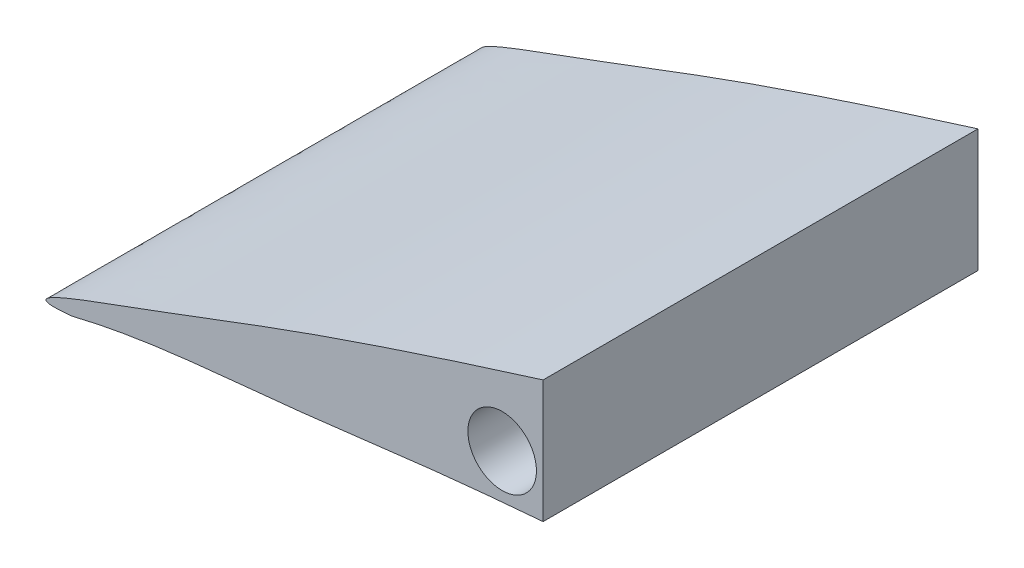
ISO-10303-21;
HEADER;
FILE_DESCRIPTION(('STEP AP214'),'2;1');
FILE_NAME('part.step','',(''),(''),'','','');
FILE_SCHEMA(('AUTOMOTIVE_DESIGN { 1 0 10303 214 1 1 1 1 }'));
ENDSEC;
DATA;
#1=APPLICATION_CONTEXT('core data for automotive mechanical design processes');
#2=APPLICATION_PROTOCOL_DEFINITION('international standard','automotive_design',2000,#1);
#3=PRODUCT_CONTEXT('',#1,'mechanical');
#4=PRODUCT('Part','Part','',(#3));
#5=PRODUCT_RELATED_PRODUCT_CATEGORY('part','',(#4));
#6=PRODUCT_DEFINITION_FORMATION('','',#4);
#7=PRODUCT_DEFINITION_CONTEXT('part definition',#1,'design');
#8=PRODUCT_DEFINITION('design','',#6,#7);
#9=PRODUCT_DEFINITION_SHAPE('','',#8);
#10=(LENGTH_UNIT() NAMED_UNIT(*) SI_UNIT(.MILLI.,.METRE.));
#11=(NAMED_UNIT(*) PLANE_ANGLE_UNIT() SI_UNIT($,.RADIAN.));
#12=(NAMED_UNIT(*) SI_UNIT($,.STERADIAN.) SOLID_ANGLE_UNIT());
#13=UNCERTAINTY_MEASURE_WITH_UNIT(LENGTH_MEASURE(1.E-05),#10,'distance_accuracy_value','');
#14=(GEOMETRIC_REPRESENTATION_CONTEXT(3) GLOBAL_UNCERTAINTY_ASSIGNED_CONTEXT((#13)) GLOBAL_UNIT_ASSIGNED_CONTEXT((#10,
#11,#12)) REPRESENTATION_CONTEXT('',''));
#15=CARTESIAN_POINT('',(0.,0.,0.));
#16=DIRECTION('',(0.,0.,1.));
#17=DIRECTION('',(1.,0.,0.));
#18=AXIS2_PLACEMENT_3D('',#15,#16,#17);
#19=CARTESIAN_POINT('',(-6.3156767121804,2.1580285927083,26.9875));
#20=DIRECTION('',(0.,0.,-1.));
#21=DIRECTION('',(-1.,0.,0.));
#22=AXIS2_PLACEMENT_3D('',#19,#20,#21);
#23=PLANE('',#22);
#24=CARTESIAN_POINT('',(-45.7724895500792,-12.1068503903365,26.9875));
#25=CARTESIAN_POINT('',(-41.3374436992652,-10.9992654887815,26.9875));
#26=CARTESIAN_POINT('',(-33.8316096279073,-10.5300430967119,26.9875));
#27=CARTESIAN_POINT('',(-20.4834982570784,-8.70754719775505,26.9875));
#28=CARTESIAN_POINT('',(-8.87343365419412,-8.01917435004237,26.9875));
#29=CARTESIAN_POINT('',(11.5245885947209,-6.02817132263064,26.9875));
#30=CARTESIAN_POINT('',(26.0673219730606,-5.65978493925108,26.9875));
#31=CARTESIAN_POINT('',(37.8951419594641,-5.52742505549688,26.9875));
#32=B_SPLINE_CURVE_WITH_KNOTS('',3,(#24,#25,#26,#27,#28,#29,#30,#31),.UNSPECIFIED.,.F.,.F.,(4,1,
1,1,1,4),(0.,0.144322392153104,0.23794765175378,0.427122749709389,0.512831912207282,
0.887817721212676),.UNSPECIFIED.);
#33=CARTESIAN_POINT('',(-45.7724895500792,-12.1068503903365,26.9875));
#34=VERTEX_POINT('',#33);
#35=CARTESIAN_POINT('',(-16.5624895500791,-8.53623661907283,26.9875));
#36=VERTEX_POINT('',#35);
#37=EDGE_CURVE('E84',#34,#36,#32,.T.);
#38=ORIENTED_EDGE('',*,*,#37,.T.);
#39=DIRECTION('',(0.,-1.,0.));
#40=VECTOR('',#39,1.);
#41=CARTESIAN_POINT('',(-16.5624895500792,14.1187599185989,26.9875));
#42=LINE('',#41,#40);
#43=CARTESIAN_POINT('',(-16.5624895500792,-0.920841797350323,26.9875));
#44=VERTEX_POINT('',#43);
#45=EDGE_CURVE('E56',#44,#36,#42,.T.);
#46=ORIENTED_EDGE('',*,*,#45,.F.);
#47=CARTESIAN_POINT('',(36.6810985985652,13.2095369144677,26.9875));
#48=CARTESIAN_POINT('',(19.8297656446093,9.26724001295322,26.9875));
#49=CARTESIAN_POINT('',(-2.07358994292178,3.84406830419772,26.9875));
#50=CARTESIAN_POINT('',(-31.0964662188296,-5.54591449337639,26.9875));
#51=CARTESIAN_POINT('',(-39.3167651645247,-8.80663166059082,26.9875));
#52=CARTESIAN_POINT('',(-49.5155563234086,-12.4956604853466,26.9875));
#53=CARTESIAN_POINT('',(-45.7724895500792,-12.1068503903365,26.9875));
#54=B_SPLINE_CURVE_WITH_KNOTS('',3,(#47,#48,#49,#50,#51,#52,#53),.UNSPECIFIED.,.F.,.F.,(4,1,1,1,
4),(0.118068853294986,0.630725310694853,0.824213609270468,0.940085476785923,1.),.UNSPECIFIED.);
#55=EDGE_CURVE('E63',#44,#34,#54,.T.);
#56=ORIENTED_EDGE('',*,*,#55,.T.);
#57=EDGE_LOOP('',(#38,#46,#56));
#58=FACE_BOUND('',#57,.T.);
#59=CARTESIAN_POINT('',(-19.1024895500792,-6.01085039033649,26.9875));
#60=DIRECTION('',(0.,0.,1.));
#61=DIRECTION('',(1.,0.,0.));
#62=AXIS2_PLACEMENT_3D('',#59,#60,#61);
#63=CIRCLE('',#62,2.127);
#64=CARTESIAN_POINT('',(-16.9754895500792,-6.01085039033649,26.9875));
#65=VERTEX_POINT('',#64);
#66=EDGE_CURVE('E169',#65,#65,#63,.T.);
#67=ORIENTED_EDGE('',*,*,#66,.F.);
#68=EDGE_LOOP('',(#67));
#69=FACE_BOUND('',#68,.T.);
#70=ADVANCED_FACE('F39',(#58,#69),#23,.F.);
#71=CARTESIAN_POINT('',(-6.3156767121804,2.1580285927083,0.));
#72=DIRECTION('',(0.,0.,-1.));
#73=DIRECTION('',(-1.,0.,0.));
#74=AXIS2_PLACEMENT_3D('',#71,#72,#73);
#75=PLANE('',#74);
#76=DIRECTION('',(0.,1.,0.));
#77=VECTOR('',#76,1.);
#78=CARTESIAN_POINT('',(-16.5624895500792,2.1580285927083,0.));
#79=LINE('',#78,#77);
#80=CARTESIAN_POINT('',(-16.5624895500792,-8.53623661907284,0.));
#81=VERTEX_POINT('',#80);
#82=CARTESIAN_POINT('',(-16.5624895500792,-0.920841797350317,0.));
#83=VERTEX_POINT('',#82);
#84=EDGE_CURVE('E77',#81,#83,#79,.T.);
#85=ORIENTED_EDGE('',*,*,#84,.F.);
#86=CARTESIAN_POINT('',(-45.7724895500792,-12.1068503903365,0.));
#87=CARTESIAN_POINT('',(-41.3374436992652,-10.9992654887815,0.));
#88=CARTESIAN_POINT('',(-33.8316096279073,-10.5300430967119,0.));
#89=CARTESIAN_POINT('',(-20.4834982570784,-8.70754719775505,0.));
#90=CARTESIAN_POINT('',(-8.87343365419412,-8.01917435004237,0.));
#91=CARTESIAN_POINT('',(11.5245885947209,-6.02817132263064,0.));
#92=CARTESIAN_POINT('',(26.0673219730606,-5.65978493925108,0.));
#93=CARTESIAN_POINT('',(37.8951419594641,-5.52742505549688,0.));
#94=B_SPLINE_CURVE_WITH_KNOTS('',3,(#86,#87,#88,#89,#90,#91,#92,#93),.UNSPECIFIED.,.F.,.F.,(4,1,
1,1,1,4),(0.,0.144322392153104,0.23794765175378,0.427122749709389,0.512831912207282,
0.887817721212676),.UNSPECIFIED.);
#95=CARTESIAN_POINT('',(-45.7724895500792,-12.1068503903365,0.));
#96=VERTEX_POINT('',#95);
#97=EDGE_CURVE('E90',#96,#81,#94,.T.);
#98=ORIENTED_EDGE('',*,*,#97,.F.);
#99=CARTESIAN_POINT('',(36.6810985985652,13.2095369144677,0.));
#100=CARTESIAN_POINT('',(19.8297656446093,9.26724001295322,0.));
#101=CARTESIAN_POINT('',(-2.07358994292178,3.84406830419772,0.));
#102=CARTESIAN_POINT('',(-31.0964662188296,-5.54591449337639,0.));
#103=CARTESIAN_POINT('',(-39.3167651645247,-8.80663166059082,0.));
#104=CARTESIAN_POINT('',(-49.5155563234086,-12.4956604853466,0.));
#105=CARTESIAN_POINT('',(-45.7724895500792,-12.1068503903365,0.));
#106=B_SPLINE_CURVE_WITH_KNOTS('',3,(#99,#100,#101,#102,#103,#104,#105),.UNSPECIFIED.,.F.,.F.,
(4,1,1,1,4),(0.118068853294986,0.630725310694853,0.824213609270468,0.940085476785923,1.),.UNSPECIFIED.);
#107=EDGE_CURVE('E95',#83,#96,#106,.T.);
#108=ORIENTED_EDGE('',*,*,#107,.F.);
#109=EDGE_LOOP('',(#85,#98,#108));
#110=FACE_BOUND('',#109,.T.);
#111=CARTESIAN_POINT('',(-19.1024895500792,-6.01085039033649,0.));
#112=DIRECTION('',(0.,0.,1.));
#113=DIRECTION('',(1.,0.,0.));
#114=AXIS2_PLACEMENT_3D('',#111,#112,#113);
#115=CIRCLE('',#114,2.127);
#116=CARTESIAN_POINT('',(-16.9754895500792,-6.01085039033649,0.));
#117=VERTEX_POINT('',#116);
#118=EDGE_CURVE('E81',#117,#117,#115,.T.);
#119=ORIENTED_EDGE('',*,*,#118,.T.);
#120=EDGE_LOOP('',(#119));
#121=FACE_BOUND('',#120,.T.);
#122=ADVANCED_FACE('F119',(#110,#121),#75,.T.);
#123=DIRECTION('',(0.,0.,-1.));
#124=VECTOR('',#123,1.);
#125=SURFACE_OF_LINEAR_EXTRUSION('',#54,#124);
#126=ORIENTED_EDGE('',*,*,#55,.F.);
#127=DIRECTION('',(0.,0.,-1.));
#128=VECTOR('',#127,1.);
#129=CARTESIAN_POINT('',(-16.5624895500792,-0.920841796934104,26.9875));
#130=LINE('',#129,#128);
#131=EDGE_CURVE('E74',#44,#83,#130,.T.);
#132=ORIENTED_EDGE('',*,*,#131,.T.);
#133=ORIENTED_EDGE('',*,*,#107,.T.);
#134=DIRECTION('',(0.,0.,-1.));
#135=VECTOR('',#134,1.);
#136=CARTESIAN_POINT('',(-45.7724895500792,-12.1068503903365,26.9875));
#137=LINE('',#136,#135);
#138=EDGE_CURVE('E49',#34,#96,#137,.T.);
#139=ORIENTED_EDGE('',*,*,#138,.F.);
#140=EDGE_LOOP('',(#126,#132,#133,#139));
#141=FACE_BOUND('',#140,.T.);
#142=ADVANCED_FACE('F41',(#141),#125,.F.);
#143=DIRECTION('',(0.,0.,-1.));
#144=VECTOR('',#143,1.);
#145=SURFACE_OF_LINEAR_EXTRUSION('',#32,#144);
#146=ORIENTED_EDGE('',*,*,#97,.T.);
#147=DIRECTION('',(0.,0.,-1.));
#148=VECTOR('',#147,1.);
#149=CARTESIAN_POINT('',(-16.5624895500792,-8.53623661907284,26.9875));
#150=LINE('',#149,#148);
#151=EDGE_CURVE('E11',#81,#36,#150,.F.);
#152=ORIENTED_EDGE('',*,*,#151,.T.);
#153=ORIENTED_EDGE('',*,*,#37,.F.);
#154=ORIENTED_EDGE('',*,*,#138,.T.);
#155=EDGE_LOOP('',(#146,#152,#153,#154));
#156=FACE_BOUND('',#155,.T.);
#157=ADVANCED_FACE('F114',(#156),#145,.F.);
#158=CARTESIAN_POINT('',(-19.1024895500792,-6.01085039033649,26.9875));
#159=DIRECTION('',(0.,0.,-1.));
#160=DIRECTION('',(-1.,0.,0.));
#161=AXIS2_PLACEMENT_3D('',#158,#159,#160);
#162=CYLINDRICAL_SURFACE('',#161,2.127);
#163=ORIENTED_EDGE('',*,*,#66,.T.);
#164=EDGE_LOOP('',(#163));
#165=FACE_BOUND('',#164,.T.);
#166=ORIENTED_EDGE('',*,*,#118,.F.);
#167=EDGE_LOOP('',(#166));
#168=FACE_BOUND('',#167,.T.);
#169=ADVANCED_FACE('F117',(#165,#168),#162,.F.);
#170=CARTESIAN_POINT('',(-16.5624895500792,14.1187599185989,-0.0889000000000029));
#171=DIRECTION('',(-1.,0.,0.));
#172=DIRECTION('',(0.,-1.,0.));
#173=AXIS2_PLACEMENT_3D('',#170,#171,#172);
#174=PLANE('',#173);
#175=ORIENTED_EDGE('',*,*,#45,.T.);
#176=ORIENTED_EDGE('',*,*,#151,.F.);
#177=ORIENTED_EDGE('',*,*,#84,.T.);
#178=ORIENTED_EDGE('',*,*,#131,.F.);
#179=EDGE_LOOP('',(#175,#176,#177,#178));
#180=FACE_BOUND('',#179,.T.);
#181=ADVANCED_FACE('F75',(#180),#174,.F.);
#182=CLOSED_SHELL('',(#70,#122,#142,#157,#169,#181));
#183=MANIFOLD_SOLID_BREP('B2',#182);
#184=ADVANCED_BREP_SHAPE_REPRESENTATION('',(#18,#183),#14);
#185=SHAPE_DEFINITION_REPRESENTATION(#9,#184);
ENDSEC;
END-ISO-10303-21;
